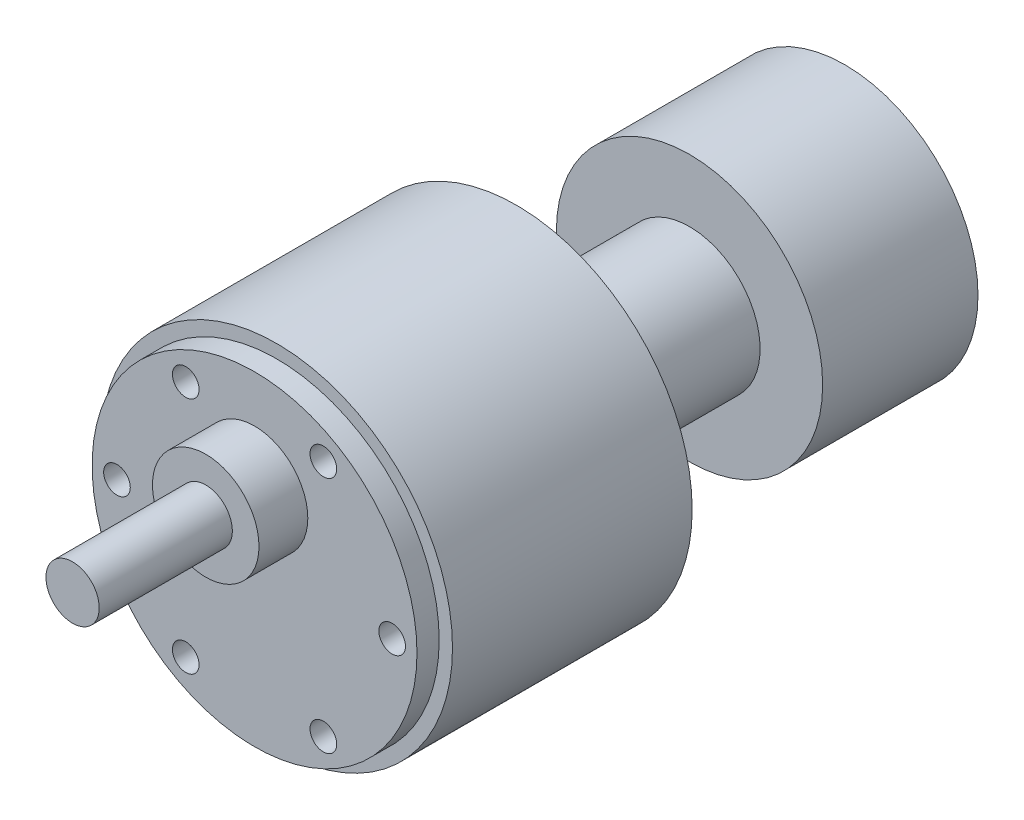
ISO-10303-21;
HEADER;
FILE_DESCRIPTION(('STEP AP214'),'2;1');
FILE_NAME('part.step','',(''),(''),'','','');
FILE_SCHEMA(('AUTOMOTIVE_DESIGN { 1 0 10303 214 1 1 1 1 }'));
ENDSEC;
DATA;
#1=APPLICATION_CONTEXT('core data for automotive mechanical design processes');
#2=APPLICATION_PROTOCOL_DEFINITION('international standard','automotive_design',2000,#1);
#3=PRODUCT_CONTEXT('',#1,'mechanical');
#4=PRODUCT('Part','Part','',(#3));
#5=PRODUCT_RELATED_PRODUCT_CATEGORY('part','',(#4));
#6=PRODUCT_DEFINITION_FORMATION('','',#4);
#7=PRODUCT_DEFINITION_CONTEXT('part definition',#1,'design');
#8=PRODUCT_DEFINITION('design','',#6,#7);
#9=PRODUCT_DEFINITION_SHAPE('','',#8);
#10=(LENGTH_UNIT() NAMED_UNIT(*) SI_UNIT(.MILLI.,.METRE.));
#11=(NAMED_UNIT(*) PLANE_ANGLE_UNIT() SI_UNIT($,.RADIAN.));
#12=(NAMED_UNIT(*) SI_UNIT($,.STERADIAN.) SOLID_ANGLE_UNIT());
#13=UNCERTAINTY_MEASURE_WITH_UNIT(LENGTH_MEASURE(1.E-05),#10,'distance_accuracy_value','');
#14=(GEOMETRIC_REPRESENTATION_CONTEXT(3) GLOBAL_UNCERTAINTY_ASSIGNED_CONTEXT((#13)) GLOBAL_UNIT_ASSIGNED_CONTEXT((#10,
#11,#12)) REPRESENTATION_CONTEXT('',''));
#15=CARTESIAN_POINT('',(0.,0.,0.));
#16=DIRECTION('',(0.,0.,1.));
#17=DIRECTION('',(1.,0.,0.));
#18=AXIS2_PLACEMENT_3D('',#15,#16,#17);
#19=CARTESIAN_POINT('',(0.,0.,33.25));
#20=DIRECTION('',(0.,0.,-1.));
#21=DIRECTION('',(-1.,0.,0.));
#22=AXIS2_PLACEMENT_3D('',#19,#20,#21);
#23=CYLINDRICAL_SURFACE('',#22,7.95372871307243);
#24=CARTESIAN_POINT('',(0.,0.,3.75));
#25=DIRECTION('',(0.,0.,1.));
#26=DIRECTION('',(1.,0.,0.));
#27=AXIS2_PLACEMENT_3D('',#24,#25,#26);
#28=CIRCLE('',#27,7.95372871307243);
#29=CARTESIAN_POINT('',(7.95372871307243,0.,3.75));
#30=VERTEX_POINT('',#29);
#31=EDGE_CURVE('E43',#30,#30,#28,.T.);
#32=ORIENTED_EDGE('',*,*,#31,.F.);
#33=EDGE_LOOP('',(#32));
#34=FACE_BOUND('',#33,.T.);
#35=CARTESIAN_POINT('',(0.,0.,-15.75));
#36=DIRECTION('',(0.,0.,-1.));
#37=DIRECTION('',(-1.,0.,0.));
#38=AXIS2_PLACEMENT_3D('',#35,#36,#37);
#39=CIRCLE('',#38,7.95372871307243);
#40=CARTESIAN_POINT('',(-7.95372871307243,0.,-15.75));
#41=VERTEX_POINT('',#40);
#42=EDGE_CURVE('E35',#41,#41,#39,.T.);
#43=ORIENTED_EDGE('',*,*,#42,.F.);
#44=EDGE_LOOP('',(#43));
#45=FACE_BOUND('',#44,.T.);
#46=ADVANCED_FACE('F32',(#34,#45),#23,.T.);
#47=CARTESIAN_POINT('',(0.,0.,3.75));
#48=DIRECTION('',(0.,0.,1.));
#49=DIRECTION('',(1.,0.,0.));
#50=AXIS2_PLACEMENT_3D('',#47,#48,#49);
#51=CYLINDRICAL_SURFACE('',#50,19.8);
#52=CARTESIAN_POINT('',(0.,0.,3.75));
#53=DIRECTION('',(0.,0.,1.));
#54=DIRECTION('',(1.,0.,0.));
#55=AXIS2_PLACEMENT_3D('',#52,#53,#54);
#56=CIRCLE('',#55,19.8);
#57=CARTESIAN_POINT('',(19.8,0.,3.75));
#58=VERTEX_POINT('',#57);
#59=EDGE_CURVE('E61',#58,#58,#56,.T.);
#60=ORIENTED_EDGE('',*,*,#59,.T.);
#61=EDGE_LOOP('',(#60));
#62=FACE_BOUND('',#61,.T.);
#63=CARTESIAN_POINT('',(0.,0.,30.75));
#64=DIRECTION('',(0.,0.,1.));
#65=DIRECTION('',(1.,0.,0.));
#66=AXIS2_PLACEMENT_3D('',#63,#64,#65);
#67=CIRCLE('',#66,19.8);
#68=CARTESIAN_POINT('',(19.8,0.,30.75));
#69=VERTEX_POINT('',#68);
#70=EDGE_CURVE('E58',#69,#69,#67,.T.);
#71=ORIENTED_EDGE('',*,*,#70,.F.);
#72=EDGE_LOOP('',(#71));
#73=FACE_BOUND('',#72,.T.);
#74=ADVANCED_FACE('F79',(#62,#73),#51,.T.);
#75=CARTESIAN_POINT('',(0.,0.,3.75));
#76=DIRECTION('',(0.,0.,1.));
#77=DIRECTION('',(1.,0.,0.));
#78=AXIS2_PLACEMENT_3D('',#75,#76,#77);
#79=PLANE('',#78);
#80=ORIENTED_EDGE('',*,*,#31,.T.);
#81=EDGE_LOOP('',(#80));
#82=FACE_BOUND('',#81,.T.);
#83=ORIENTED_EDGE('',*,*,#59,.F.);
#84=EDGE_LOOP('',(#83));
#85=FACE_BOUND('',#84,.T.);
#86=ADVANCED_FACE('F74',(#82,#85),#79,.F.);
#87=CARTESIAN_POINT('',(0.,0.,30.75));
#88=DIRECTION('',(0.,0.,1.));
#89=DIRECTION('',(1.,0.,0.));
#90=AXIS2_PLACEMENT_3D('',#87,#88,#89);
#91=PLANE('',#90);
#92=CARTESIAN_POINT('',(0.,0.,30.75));
#93=DIRECTION('',(0.,0.,1.));
#94=DIRECTION('',(1.,0.,0.));
#95=AXIS2_PLACEMENT_3D('',#92,#93,#94);
#96=CIRCLE('',#95,18.3);
#97=CARTESIAN_POINT('',(18.3,0.,30.75));
#98=VERTEX_POINT('',#97);
#99=EDGE_CURVE('E64',#98,#98,#96,.T.);
#100=ORIENTED_EDGE('',*,*,#99,.F.);
#101=EDGE_LOOP('',(#100));
#102=FACE_BOUND('',#101,.T.);
#103=ORIENTED_EDGE('',*,*,#70,.T.);
#104=EDGE_LOOP('',(#103));
#105=FACE_BOUND('',#104,.T.);
#106=ADVANCED_FACE('F108',(#102,#105),#91,.T.);
#107=CARTESIAN_POINT('',(0.,0.,33.25));
#108=DIRECTION('',(0.,0.,1.));
#109=DIRECTION('',(1.,0.,0.));
#110=AXIS2_PLACEMENT_3D('',#107,#108,#109);
#111=PLANE('',#110);
#112=CARTESIAN_POINT('',(-7.75000000000016,-13.4233937586587,33.25));
#113=DIRECTION('',(0.,0.,1.));
#114=DIRECTION('',(0.50000000000001,0.866025403784433,0.));
#115=AXIS2_PLACEMENT_3D('',#112,#113,#114);
#116=CIRCLE('',#115,1.5);
#117=CARTESIAN_POINT('',(-7.00000000000014,-12.1243556529821,33.25));
#118=VERTEX_POINT('',#117);
#119=EDGE_CURVE('E206',#118,#118,#116,.T.);
#120=ORIENTED_EDGE('',*,*,#119,.F.);
#121=EDGE_LOOP('',(#120));
#122=FACE_BOUND('',#121,.T.);
#123=CARTESIAN_POINT('',(7.74999999999987,-13.4233937586589,33.25));
#124=DIRECTION('',(0.,0.,1.));
#125=DIRECTION('',(-0.499999999999992,0.866025403784443,0.));
#126=AXIS2_PLACEMENT_3D('',#123,#124,#125);
#127=CIRCLE('',#126,1.5);
#128=CARTESIAN_POINT('',(6.99999999999989,-12.1243556529822,33.25));
#129=VERTEX_POINT('',#128);
#130=EDGE_CURVE('E200',#129,#129,#127,.T.);
#131=ORIENTED_EDGE('',*,*,#130,.F.);
#132=EDGE_LOOP('',(#131));
#133=FACE_BOUND('',#132,.T.);
#134=CARTESIAN_POINT('',(15.5,0.,33.25));
#135=DIRECTION('',(0.,0.,1.));
#136=DIRECTION('',(-1.,0.,0.));
#137=AXIS2_PLACEMENT_3D('',#134,#135,#136);
#138=CIRCLE('',#137,1.5);
#139=CARTESIAN_POINT('',(14.,0.,33.25));
#140=VERTEX_POINT('',#139);
#141=EDGE_CURVE('E194',#140,#140,#138,.T.);
#142=ORIENTED_EDGE('',*,*,#141,.F.);
#143=EDGE_LOOP('',(#142));
#144=FACE_BOUND('',#143,.T.);
#145=CARTESIAN_POINT('',(7.75000000000006,13.4233937586588,33.25));
#146=DIRECTION('',(0.,0.,1.));
#147=DIRECTION('',(-0.500000000000004,-0.866025403784436,0.));
#148=AXIS2_PLACEMENT_3D('',#145,#146,#147);
#149=CIRCLE('',#148,1.5);
#150=CARTESIAN_POINT('',(7.00000000000006,12.1243556529821,33.25));
#151=VERTEX_POINT('',#150);
#152=EDGE_CURVE('E185',#151,#151,#149,.T.);
#153=ORIENTED_EDGE('',*,*,#152,.F.);
#154=EDGE_LOOP('',(#153));
#155=FACE_BOUND('',#154,.T.);
#156=CARTESIAN_POINT('',(-7.74999999999997,13.4233937586588,33.25));
#157=DIRECTION('',(0.,0.,1.));
#158=DIRECTION('',(0.499999999999998,-0.86602540378444,0.));
#159=AXIS2_PLACEMENT_3D('',#156,#157,#158);
#160=CIRCLE('',#159,1.5);
#161=CARTESIAN_POINT('',(-6.99999999999997,12.1243556529822,33.25));
#162=VERTEX_POINT('',#161);
#163=EDGE_CURVE('E184',#162,#162,#160,.T.);
#164=ORIENTED_EDGE('',*,*,#163,.F.);
#165=EDGE_LOOP('',(#164));
#166=FACE_BOUND('',#165,.T.);
#167=CARTESIAN_POINT('',(-15.5,0.,33.25));
#168=DIRECTION('',(0.,0.,1.));
#169=DIRECTION('',(1.,0.,0.));
#170=AXIS2_PLACEMENT_3D('',#167,#168,#169);
#171=CIRCLE('',#170,1.5);
#172=CARTESIAN_POINT('',(-14.,0.,33.25));
#173=VERTEX_POINT('',#172);
#174=EDGE_CURVE('E213',#173,#173,#171,.T.);
#175=ORIENTED_EDGE('',*,*,#174,.F.);
#176=EDGE_LOOP('',(#175));
#177=FACE_BOUND('',#176,.T.);
#178=CARTESIAN_POINT('',(0.,7.,33.25));
#179=DIRECTION('',(0.,0.,1.));
#180=DIRECTION('',(1.,0.,0.));
#181=AXIS2_PLACEMENT_3D('',#178,#179,#180);
#182=CIRCLE('',#181,6.);
#183=CARTESIAN_POINT('',(6.,7.,33.25));
#184=VERTEX_POINT('',#183);
#185=EDGE_CURVE('E52',#184,#184,#182,.T.);
#186=ORIENTED_EDGE('',*,*,#185,.F.);
#187=EDGE_LOOP('',(#186));
#188=FACE_BOUND('',#187,.T.);
#189=CARTESIAN_POINT('',(0.,0.,33.25));
#190=DIRECTION('',(0.,0.,1.));
#191=DIRECTION('',(1.,0.,0.));
#192=AXIS2_PLACEMENT_3D('',#189,#190,#191);
#193=CIRCLE('',#192,18.3);
#194=CARTESIAN_POINT('',(18.3,0.,33.25));
#195=VERTEX_POINT('',#194);
#196=EDGE_CURVE('E69',#195,#195,#193,.T.);
#197=ORIENTED_EDGE('',*,*,#196,.T.);
#198=EDGE_LOOP('',(#197));
#199=FACE_BOUND('',#198,.T.);
#200=ADVANCED_FACE('F105',(#122,#133,#144,#155,#166,#177,#188,#199),#111,.T.);
#201=CARTESIAN_POINT('',(0.,0.,33.25));
#202=DIRECTION('',(0.,0.,-1.));
#203=DIRECTION('',(-1.,0.,0.));
#204=AXIS2_PLACEMENT_3D('',#201,#202,#203);
#205=CYLINDRICAL_SURFACE('',#204,18.3);
#206=ORIENTED_EDGE('',*,*,#196,.F.);
#207=EDGE_LOOP('',(#206));
#208=FACE_BOUND('',#207,.T.);
#209=ORIENTED_EDGE('',*,*,#99,.T.);
#210=EDGE_LOOP('',(#209));
#211=FACE_BOUND('',#210,.T.);
#212=ADVANCED_FACE('F92',(#208,#211),#205,.T.);
#213=CARTESIAN_POINT('',(0.,0.,-15.75));
#214=DIRECTION('',(0.,0.,-1.));
#215=DIRECTION('',(-1.,0.,0.));
#216=AXIS2_PLACEMENT_3D('',#213,#214,#215);
#217=CYLINDRICAL_SURFACE('',#216,15.);
#218=CARTESIAN_POINT('',(0.,0.,-15.75));
#219=DIRECTION('',(0.,0.,-1.));
#220=DIRECTION('',(-1.,0.,0.));
#221=AXIS2_PLACEMENT_3D('',#218,#219,#220);
#222=CIRCLE('',#221,15.);
#223=CARTESIAN_POINT('',(-15.,0.,-15.75));
#224=VERTEX_POINT('',#223);
#225=EDGE_CURVE('E55',#224,#224,#222,.T.);
#226=ORIENTED_EDGE('',*,*,#225,.T.);
#227=EDGE_LOOP('',(#226));
#228=FACE_BOUND('',#227,.T.);
#229=CARTESIAN_POINT('',(0.,0.,-33.25));
#230=DIRECTION('',(0.,0.,-1.));
#231=DIRECTION('',(-1.,0.,0.));
#232=AXIS2_PLACEMENT_3D('',#229,#230,#231);
#233=CIRCLE('',#232,15.);
#234=CARTESIAN_POINT('',(-15.,0.,-33.25));
#235=VERTEX_POINT('',#234);
#236=EDGE_CURVE('E51',#235,#235,#233,.T.);
#237=ORIENTED_EDGE('',*,*,#236,.F.);
#238=EDGE_LOOP('',(#237));
#239=FACE_BOUND('',#238,.T.);
#240=ADVANCED_FACE('F86',(#228,#239),#217,.T.);
#241=CARTESIAN_POINT('',(0.,0.,-15.75));
#242=DIRECTION('',(0.,0.,-1.));
#243=DIRECTION('',(-1.,0.,0.));
#244=AXIS2_PLACEMENT_3D('',#241,#242,#243);
#245=PLANE('',#244);
#246=ORIENTED_EDGE('',*,*,#42,.T.);
#247=EDGE_LOOP('',(#246));
#248=FACE_BOUND('',#247,.T.);
#249=ORIENTED_EDGE('',*,*,#225,.F.);
#250=EDGE_LOOP('',(#249));
#251=FACE_BOUND('',#250,.T.);
#252=ADVANCED_FACE('F82',(#248,#251),#245,.F.);
#253=CARTESIAN_POINT('',(0.,0.,-33.25));
#254=DIRECTION('',(0.,0.,1.));
#255=DIRECTION('',(1.,0.,0.));
#256=AXIS2_PLACEMENT_3D('',#253,#254,#255);
#257=PLANE('',#256);
#258=ORIENTED_EDGE('',*,*,#236,.T.);
#259=EDGE_LOOP('',(#258));
#260=FACE_BOUND('',#259,.T.);
#261=ADVANCED_FACE('F85',(#260),#257,.F.);
#262=CARTESIAN_POINT('',(0.,7.,38.75));
#263=DIRECTION('',(0.,0.,-1.));
#264=DIRECTION('',(-1.,0.,0.));
#265=AXIS2_PLACEMENT_3D('',#262,#263,#264);
#266=CYLINDRICAL_SURFACE('',#265,6.);
#267=CARTESIAN_POINT('',(0.,7.,38.75));
#268=DIRECTION('',(0.,0.,1.));
#269=DIRECTION('',(1.,0.,0.));
#270=AXIS2_PLACEMENT_3D('',#267,#268,#269);
#271=CIRCLE('',#270,6.);
#272=CARTESIAN_POINT('',(6.,7.,38.75));
#273=VERTEX_POINT('',#272);
#274=EDGE_CURVE('E48',#273,#273,#271,.T.);
#275=ORIENTED_EDGE('',*,*,#274,.F.);
#276=EDGE_LOOP('',(#275));
#277=FACE_BOUND('',#276,.T.);
#278=ORIENTED_EDGE('',*,*,#185,.T.);
#279=EDGE_LOOP('',(#278));
#280=FACE_BOUND('',#279,.T.);
#281=ADVANCED_FACE('F97',(#277,#280),#266,.T.);
#282=CARTESIAN_POINT('',(0.,7.,38.75));
#283=DIRECTION('',(0.,0.,1.));
#284=DIRECTION('',(1.,0.,0.));
#285=AXIS2_PLACEMENT_3D('',#282,#283,#284);
#286=PLANE('',#285);
#287=CARTESIAN_POINT('',(0.,7.,38.75));
#288=DIRECTION('',(0.,0.,1.));
#289=DIRECTION('',(1.,0.,0.));
#290=AXIS2_PLACEMENT_3D('',#287,#288,#289);
#291=CIRCLE('',#290,3.);
#292=CARTESIAN_POINT('',(3.,7.,38.75));
#293=VERTEX_POINT('',#292);
#294=EDGE_CURVE('E10',#293,#293,#291,.T.);
#295=ORIENTED_EDGE('',*,*,#294,.F.);
#296=EDGE_LOOP('',(#295));
#297=FACE_BOUND('',#296,.T.);
#298=ORIENTED_EDGE('',*,*,#274,.T.);
#299=EDGE_LOOP('',(#298));
#300=FACE_BOUND('',#299,.T.);
#301=ADVANCED_FACE('F101',(#297,#300),#286,.T.);
#302=CARTESIAN_POINT('',(0.,7.,53.75));
#303=DIRECTION('',(0.,0.,-1.));
#304=DIRECTION('',(-1.,0.,0.));
#305=AXIS2_PLACEMENT_3D('',#302,#303,#304);
#306=CYLINDRICAL_SURFACE('',#305,3.);
#307=CARTESIAN_POINT('',(0.,7.,53.75));
#308=DIRECTION('',(0.,0.,1.));
#309=DIRECTION('',(1.,0.,0.));
#310=AXIS2_PLACEMENT_3D('',#307,#308,#309);
#311=CIRCLE('',#310,3.);
#312=CARTESIAN_POINT('',(3.,7.,53.75));
#313=VERTEX_POINT('',#312);
#314=EDGE_CURVE('E46',#313,#313,#311,.T.);
#315=ORIENTED_EDGE('',*,*,#314,.F.);
#316=EDGE_LOOP('',(#315));
#317=FACE_BOUND('',#316,.T.);
#318=ORIENTED_EDGE('',*,*,#294,.T.);
#319=EDGE_LOOP('',(#318));
#320=FACE_BOUND('',#319,.T.);
#321=ADVANCED_FACE('F123',(#317,#320),#306,.T.);
#322=CARTESIAN_POINT('',(0.,7.,53.75));
#323=DIRECTION('',(0.,0.,1.));
#324=DIRECTION('',(1.,0.,0.));
#325=AXIS2_PLACEMENT_3D('',#322,#323,#324);
#326=PLANE('',#325);
#327=ORIENTED_EDGE('',*,*,#314,.T.);
#328=EDGE_LOOP('',(#327));
#329=FACE_BOUND('',#328,.T.);
#330=ADVANCED_FACE('F127',(#329),#326,.T.);
#331=CARTESIAN_POINT('',(-15.5,0.,29.25));
#332=DIRECTION('',(0.,0.,1.));
#333=DIRECTION('',(1.,0.,0.));
#334=AXIS2_PLACEMENT_3D('',#331,#332,#333);
#335=CYLINDRICAL_SURFACE('',#334,1.5);
#336=CARTESIAN_POINT('',(-15.5,0.,29.25));
#337=DIRECTION('',(0.,0.,1.));
#338=DIRECTION('',(1.,0.,0.));
#339=AXIS2_PLACEMENT_3D('',#336,#337,#338);
#340=CIRCLE('',#339,1.5);
#341=CARTESIAN_POINT('',(-14.,0.,29.25));
#342=VERTEX_POINT('',#341);
#343=EDGE_CURVE('E214',#342,#342,#340,.T.);
#344=ORIENTED_EDGE('',*,*,#343,.F.);
#345=EDGE_LOOP('',(#344));
#346=FACE_BOUND('',#345,.T.);
#347=ORIENTED_EDGE('',*,*,#174,.T.);
#348=EDGE_LOOP('',(#347));
#349=FACE_BOUND('',#348,.T.);
#350=ADVANCED_FACE('F131',(#346,#349),#335,.F.);
#351=CARTESIAN_POINT('',(-15.5,0.,29.25));
#352=DIRECTION('',(0.,0.,1.));
#353=DIRECTION('',(1.,0.,0.));
#354=AXIS2_PLACEMENT_3D('',#351,#352,#353);
#355=PLANE('',#354);
#356=ORIENTED_EDGE('',*,*,#343,.T.);
#357=EDGE_LOOP('',(#356));
#358=FACE_BOUND('',#357,.T.);
#359=ADVANCED_FACE('F135',(#358),#355,.T.);
#360=CARTESIAN_POINT('',(-7.74999999999997,13.4233937586588,29.25));
#361=DIRECTION('',(0.,0.,1.));
#362=DIRECTION('',(0.499999999999998,-0.86602540378444,0.));
#363=AXIS2_PLACEMENT_3D('',#360,#361,#362);
#364=CYLINDRICAL_SURFACE('',#363,1.5);
#365=CARTESIAN_POINT('',(-7.74999999999997,13.4233937586588,29.25));
#366=DIRECTION('',(0.,0.,1.));
#367=DIRECTION('',(0.499999999999998,-0.86602540378444,0.));
#368=AXIS2_PLACEMENT_3D('',#365,#366,#367);
#369=CIRCLE('',#368,1.5);
#370=CARTESIAN_POINT('',(-6.99999999999997,12.1243556529822,29.25));
#371=VERTEX_POINT('',#370);
#372=EDGE_CURVE('E188',#371,#371,#369,.T.);
#373=ORIENTED_EDGE('',*,*,#372,.F.);
#374=EDGE_LOOP('',(#373));
#375=FACE_BOUND('',#374,.T.);
#376=ORIENTED_EDGE('',*,*,#163,.T.);
#377=EDGE_LOOP('',(#376));
#378=FACE_BOUND('',#377,.T.);
#379=ADVANCED_FACE('F139',(#375,#378),#364,.F.);
#380=CARTESIAN_POINT('',(-7.74999999999997,13.4233937586588,29.25));
#381=DIRECTION('',(0.,0.,1.));
#382=DIRECTION('',(0.499999999999998,-0.86602540378444,0.));
#383=AXIS2_PLACEMENT_3D('',#380,#381,#382);
#384=PLANE('',#383);
#385=ORIENTED_EDGE('',*,*,#372,.T.);
#386=EDGE_LOOP('',(#385));
#387=FACE_BOUND('',#386,.T.);
#388=ADVANCED_FACE('F143',(#387),#384,.T.);
#389=CARTESIAN_POINT('',(7.75000000000006,13.4233937586588,29.25));
#390=DIRECTION('',(0.,0.,1.));
#391=DIRECTION('',(-0.500000000000004,-0.866025403784436,0.));
#392=AXIS2_PLACEMENT_3D('',#389,#390,#391);
#393=CYLINDRICAL_SURFACE('',#392,1.5);
#394=CARTESIAN_POINT('',(7.75000000000006,13.4233937586588,29.25));
#395=DIRECTION('',(0.,0.,1.));
#396=DIRECTION('',(-0.500000000000004,-0.866025403784436,0.));
#397=AXIS2_PLACEMENT_3D('',#394,#395,#396);
#398=CIRCLE('',#397,1.5);
#399=CARTESIAN_POINT('',(7.00000000000006,12.1243556529821,29.25));
#400=VERTEX_POINT('',#399);
#401=EDGE_CURVE('E183',#400,#400,#398,.T.);
#402=ORIENTED_EDGE('',*,*,#401,.F.);
#403=EDGE_LOOP('',(#402));
#404=FACE_BOUND('',#403,.T.);
#405=ORIENTED_EDGE('',*,*,#152,.T.);
#406=EDGE_LOOP('',(#405));
#407=FACE_BOUND('',#406,.T.);
#408=ADVANCED_FACE('F147',(#404,#407),#393,.F.);
#409=CARTESIAN_POINT('',(7.75000000000006,13.4233937586588,29.25));
#410=DIRECTION('',(0.,0.,1.));
#411=DIRECTION('',(-0.500000000000004,-0.866025403784436,0.));
#412=AXIS2_PLACEMENT_3D('',#409,#410,#411);
#413=PLANE('',#412);
#414=ORIENTED_EDGE('',*,*,#401,.T.);
#415=EDGE_LOOP('',(#414));
#416=FACE_BOUND('',#415,.T.);
#417=ADVANCED_FACE('F169',(#416),#413,.T.);
#418=CARTESIAN_POINT('',(15.5,0.,29.25));
#419=DIRECTION('',(0.,0.,1.));
#420=DIRECTION('',(-1.,0.,0.));
#421=AXIS2_PLACEMENT_3D('',#418,#419,#420);
#422=CYLINDRICAL_SURFACE('',#421,1.5);
#423=CARTESIAN_POINT('',(15.5,0.,29.25));
#424=DIRECTION('',(0.,0.,1.));
#425=DIRECTION('',(-1.,0.,0.));
#426=AXIS2_PLACEMENT_3D('',#423,#424,#425);
#427=CIRCLE('',#426,1.5);
#428=CARTESIAN_POINT('',(14.,0.,29.25));
#429=VERTEX_POINT('',#428);
#430=EDGE_CURVE('E191',#429,#429,#427,.T.);
#431=ORIENTED_EDGE('',*,*,#430,.F.);
#432=EDGE_LOOP('',(#431));
#433=FACE_BOUND('',#432,.T.);
#434=ORIENTED_EDGE('',*,*,#141,.T.);
#435=EDGE_LOOP('',(#434));
#436=FACE_BOUND('',#435,.T.);
#437=ADVANCED_FACE('F166',(#433,#436),#422,.F.);
#438=CARTESIAN_POINT('',(15.5,0.,29.25));
#439=DIRECTION('',(0.,0.,1.));
#440=DIRECTION('',(-1.,0.,0.));
#441=AXIS2_PLACEMENT_3D('',#438,#439,#440);
#442=PLANE('',#441);
#443=ORIENTED_EDGE('',*,*,#430,.T.);
#444=EDGE_LOOP('',(#443));
#445=FACE_BOUND('',#444,.T.);
#446=ADVANCED_FACE('F161',(#445),#442,.T.);
#447=CARTESIAN_POINT('',(7.74999999999987,-13.4233937586589,29.25));
#448=DIRECTION('',(0.,0.,1.));
#449=DIRECTION('',(-0.499999999999992,0.866025403784443,0.));
#450=AXIS2_PLACEMENT_3D('',#447,#448,#449);
#451=CYLINDRICAL_SURFACE('',#450,1.5);
#452=CARTESIAN_POINT('',(7.74999999999987,-13.4233937586589,29.25));
#453=DIRECTION('',(0.,0.,1.));
#454=DIRECTION('',(-0.499999999999992,0.866025403784443,0.));
#455=AXIS2_PLACEMENT_3D('',#452,#453,#454);
#456=CIRCLE('',#455,1.5);
#457=CARTESIAN_POINT('',(6.99999999999989,-12.1243556529822,29.25));
#458=VERTEX_POINT('',#457);
#459=EDGE_CURVE('E197',#458,#458,#456,.T.);
#460=ORIENTED_EDGE('',*,*,#459,.F.);
#461=EDGE_LOOP('',(#460));
#462=FACE_BOUND('',#461,.T.);
#463=ORIENTED_EDGE('',*,*,#130,.T.);
#464=EDGE_LOOP('',(#463));
#465=FACE_BOUND('',#464,.T.);
#466=ADVANCED_FACE('F158',(#462,#465),#451,.F.);
#467=CARTESIAN_POINT('',(7.74999999999987,-13.4233937586589,29.25));
#468=DIRECTION('',(0.,0.,1.));
#469=DIRECTION('',(-0.499999999999992,0.866025403784443,0.));
#470=AXIS2_PLACEMENT_3D('',#467,#468,#469);
#471=PLANE('',#470);
#472=ORIENTED_EDGE('',*,*,#459,.T.);
#473=EDGE_LOOP('',(#472));
#474=FACE_BOUND('',#473,.T.);
#475=ADVANCED_FACE('F153',(#474),#471,.T.);
#476=CARTESIAN_POINT('',(-7.75000000000016,-13.4233937586587,29.25));
#477=DIRECTION('',(0.,0.,1.));
#478=DIRECTION('',(0.50000000000001,0.866025403784433,0.));
#479=AXIS2_PLACEMENT_3D('',#476,#477,#478);
#480=CYLINDRICAL_SURFACE('',#479,1.5);
#481=CARTESIAN_POINT('',(-7.75000000000016,-13.4233937586587,29.25));
#482=DIRECTION('',(0.,0.,1.));
#483=DIRECTION('',(0.50000000000001,0.866025403784433,0.));
#484=AXIS2_PLACEMENT_3D('',#481,#482,#483);
#485=CIRCLE('',#484,1.5);
#486=CARTESIAN_POINT('',(-7.00000000000014,-12.1243556529821,29.25));
#487=VERTEX_POINT('',#486);
#488=EDGE_CURVE('E203',#487,#487,#485,.T.);
#489=ORIENTED_EDGE('',*,*,#488,.F.);
#490=EDGE_LOOP('',(#489));
#491=FACE_BOUND('',#490,.T.);
#492=ORIENTED_EDGE('',*,*,#119,.T.);
#493=EDGE_LOOP('',(#492));
#494=FACE_BOUND('',#493,.T.);
#495=ADVANCED_FACE('F149',(#491,#494),#480,.F.);
#496=CARTESIAN_POINT('',(-7.75000000000016,-13.4233937586587,29.25));
#497=DIRECTION('',(0.,0.,1.));
#498=DIRECTION('',(0.50000000000001,0.866025403784433,0.));
#499=AXIS2_PLACEMENT_3D('',#496,#497,#498);
#500=PLANE('',#499);
#501=ORIENTED_EDGE('',*,*,#488,.T.);
#502=EDGE_LOOP('',(#501));
#503=FACE_BOUND('',#502,.T.);
#504=ADVANCED_FACE('F152',(#503),#500,.T.);
#505=CLOSED_SHELL('',(#46,#74,#86,#106,#200,#212,#240,#252,#261,#281,#301,#321,#330,#350,#359,
#379,#388,#408,#417,#437,#446,#466,#475,#495,#504));
#506=MANIFOLD_SOLID_BREP('B2',#505);
#507=ADVANCED_BREP_SHAPE_REPRESENTATION('',(#18,#506),#14);
#508=SHAPE_DEFINITION_REPRESENTATION(#9,#507);
ENDSEC;
END-ISO-10303-21;
